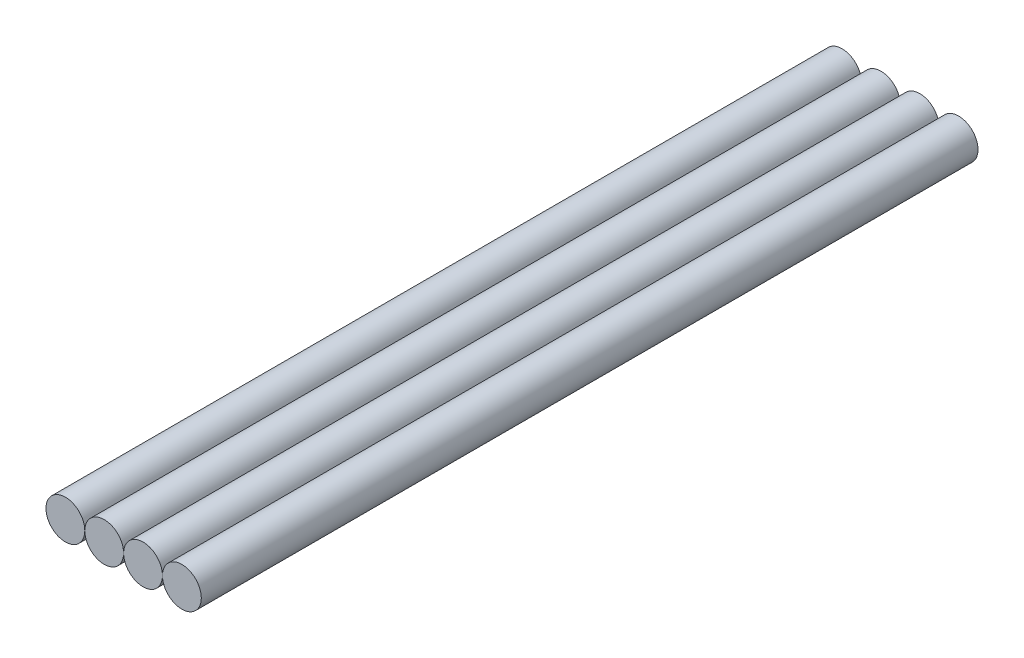
ISO-10303-21;
HEADER;
FILE_DESCRIPTION(('STEP AP214'),'2;1');
FILE_NAME('part.step','',(''),(''),'','','');
FILE_SCHEMA(('AUTOMOTIVE_DESIGN { 1 0 10303 214 1 1 1 1 }'));
ENDSEC;
DATA;
#1=APPLICATION_CONTEXT('core data for automotive mechanical design processes');
#2=APPLICATION_PROTOCOL_DEFINITION('international standard','automotive_design',2000,#1);
#3=PRODUCT_CONTEXT('',#1,'mechanical');
#4=PRODUCT('Part','Part','',(#3));
#5=PRODUCT_RELATED_PRODUCT_CATEGORY('part','',(#4));
#6=PRODUCT_DEFINITION_FORMATION('','',#4);
#7=PRODUCT_DEFINITION_CONTEXT('part definition',#1,'design');
#8=PRODUCT_DEFINITION('design','',#6,#7);
#9=PRODUCT_DEFINITION_SHAPE('','',#8);
#10=(LENGTH_UNIT() NAMED_UNIT(*) SI_UNIT(.MILLI.,.METRE.));
#11=(NAMED_UNIT(*) PLANE_ANGLE_UNIT() SI_UNIT($,.RADIAN.));
#12=(NAMED_UNIT(*) SI_UNIT($,.STERADIAN.) SOLID_ANGLE_UNIT());
#13=UNCERTAINTY_MEASURE_WITH_UNIT(LENGTH_MEASURE(1.E-05),#10,'distance_accuracy_value','');
#14=(GEOMETRIC_REPRESENTATION_CONTEXT(3) GLOBAL_UNCERTAINTY_ASSIGNED_CONTEXT((#13)) GLOBAL_UNIT_ASSIGNED_CONTEXT((#10,
#11,#12)) REPRESENTATION_CONTEXT('',''));
#15=CARTESIAN_POINT('',(0.,0.,0.));
#16=DIRECTION('',(0.,0.,1.));
#17=DIRECTION('',(1.,0.,0.));
#18=AXIS2_PLACEMENT_3D('',#15,#16,#17);
#19=CARTESIAN_POINT('',(3.26399414195173,-7.63427077836029,45.0000000000159));
#20=DIRECTION('',(0.,0.,-1.));
#21=DIRECTION('',(-1.,0.,0.));
#22=AXIS2_PLACEMENT_3D('',#19,#20,#21);
#23=CYLINDRICAL_SURFACE('',#22,0.5);
#24=CARTESIAN_POINT('',(3.26399414195173,-7.63427077836029,45.0000000000159));
#25=DIRECTION('',(0.,0.,1.));
#26=DIRECTION('',(1.,0.,0.));
#27=AXIS2_PLACEMENT_3D('',#24,#25,#26);
#28=CIRCLE('',#27,0.5);
#29=CARTESIAN_POINT('',(3.76399414195173,-7.63427077836029,45.0000000000159));
#30=VERTEX_POINT('',#29);
#31=EDGE_CURVE('E11',#30,#30,#28,.T.);
#32=ORIENTED_EDGE('',*,*,#31,.F.);
#33=EDGE_LOOP('',(#32));
#34=FACE_BOUND('',#33,.T.);
#35=CARTESIAN_POINT('',(3.26399414195173,-7.63427077836029,25.0000000000159));
#36=DIRECTION('',(0.,0.,1.));
#37=DIRECTION('',(1.,0.,0.));
#38=AXIS2_PLACEMENT_3D('',#35,#36,#37);
#39=CIRCLE('',#38,0.5);
#40=CARTESIAN_POINT('',(3.76399414195173,-7.63427077836029,25.0000000000159));
#41=VERTEX_POINT('',#40);
#42=EDGE_CURVE('E57',#41,#41,#39,.T.);
#43=ORIENTED_EDGE('',*,*,#42,.T.);
#44=EDGE_LOOP('',(#43));
#45=FACE_BOUND('',#44,.T.);
#46=ADVANCED_FACE('F54',(#34,#45),#23,.T.);
#47=CARTESIAN_POINT('',(3.26399414195173,-7.63427077836029,45.0000000000159));
#48=DIRECTION('',(0.,0.,1.));
#49=DIRECTION('',(1.,0.,0.));
#50=AXIS2_PLACEMENT_3D('',#47,#48,#49);
#51=PLANE('',#50);
#52=ORIENTED_EDGE('',*,*,#31,.T.);
#53=EDGE_LOOP('',(#52));
#54=FACE_BOUND('',#53,.T.);
#55=ADVANCED_FACE('F69',(#54),#51,.T.);
#56=CARTESIAN_POINT('',(3.26399414195173,-7.63427077836029,25.0000000000159));
#57=DIRECTION('',(0.,0.,1.));
#58=DIRECTION('',(1.,0.,0.));
#59=AXIS2_PLACEMENT_3D('',#56,#57,#58);
#60=PLANE('',#59);
#61=ORIENTED_EDGE('',*,*,#42,.F.);
#62=EDGE_LOOP('',(#61));
#63=FACE_BOUND('',#62,.T.);
#64=ADVANCED_FACE('F67',(#63),#60,.F.);
#65=CLOSED_SHELL('',(#46,#55,#64));
#66=MANIFOLD_SOLID_BREP('B2',#65);
#67=CARTESIAN_POINT('',(6.26399414195173,-7.63427077836029,45.0000000000159));
#68=DIRECTION('',(0.,0.,-1.));
#69=DIRECTION('',(-1.,0.,0.));
#70=AXIS2_PLACEMENT_3D('',#67,#68,#69);
#71=CYLINDRICAL_SURFACE('',#70,0.5);
#72=CARTESIAN_POINT('',(6.26399414195173,-7.63427077836029,45.0000000000159));
#73=DIRECTION('',(0.,0.,1.));
#74=DIRECTION('',(1.,0.,0.));
#75=AXIS2_PLACEMENT_3D('',#72,#73,#74);
#76=CIRCLE('',#75,0.5);
#77=CARTESIAN_POINT('',(6.76399414195173,-7.63427077836029,45.0000000000159));
#78=VERTEX_POINT('',#77);
#79=EDGE_CURVE('E53',#78,#78,#76,.T.);
#80=ORIENTED_EDGE('',*,*,#79,.F.);
#81=EDGE_LOOP('',(#80));
#82=FACE_BOUND('',#81,.T.);
#83=CARTESIAN_POINT('',(6.26399414195173,-7.63427077836029,25.0000000000159));
#84=DIRECTION('',(0.,0.,1.));
#85=DIRECTION('',(1.,0.,0.));
#86=AXIS2_PLACEMENT_3D('',#83,#84,#85);
#87=CIRCLE('',#86,0.5);
#88=CARTESIAN_POINT('',(6.76399414195173,-7.63427077836029,25.0000000000159));
#89=VERTEX_POINT('',#88);
#90=EDGE_CURVE('E141',#89,#89,#87,.T.);
#91=ORIENTED_EDGE('',*,*,#90,.T.);
#92=EDGE_LOOP('',(#91));
#93=FACE_BOUND('',#92,.T.);
#94=ADVANCED_FACE('F138',(#82,#93),#71,.T.);
#95=CARTESIAN_POINT('',(6.26399414195173,-7.63427077836029,45.0000000000159));
#96=DIRECTION('',(0.,0.,1.));
#97=DIRECTION('',(1.,0.,0.));
#98=AXIS2_PLACEMENT_3D('',#95,#96,#97);
#99=PLANE('',#98);
#100=ORIENTED_EDGE('',*,*,#79,.T.);
#101=EDGE_LOOP('',(#100));
#102=FACE_BOUND('',#101,.T.);
#103=ADVANCED_FACE('F153',(#102),#99,.T.);
#104=CARTESIAN_POINT('',(6.26399414195173,-7.63427077836029,25.0000000000159));
#105=DIRECTION('',(0.,0.,1.));
#106=DIRECTION('',(1.,0.,0.));
#107=AXIS2_PLACEMENT_3D('',#104,#105,#106);
#108=PLANE('',#107);
#109=ORIENTED_EDGE('',*,*,#90,.F.);
#110=EDGE_LOOP('',(#109));
#111=FACE_BOUND('',#110,.T.);
#112=ADVANCED_FACE('F151',(#111),#108,.F.);
#113=CLOSED_SHELL('',(#94,#103,#112));
#114=MANIFOLD_SOLID_BREP('B6',#113);
#115=CARTESIAN_POINT('',(5.26399414195173,-7.63427077836029,45.0000000000159));
#116=DIRECTION('',(0.,0.,-1.));
#117=DIRECTION('',(-1.,0.,0.));
#118=AXIS2_PLACEMENT_3D('',#115,#116,#117);
#119=CYLINDRICAL_SURFACE('',#118,0.5);
#120=CARTESIAN_POINT('',(5.26399414195173,-7.63427077836029,45.0000000000159));
#121=DIRECTION('',(0.,0.,1.));
#122=DIRECTION('',(1.,0.,0.));
#123=AXIS2_PLACEMENT_3D('',#120,#121,#122);
#124=CIRCLE('',#123,0.5);
#125=CARTESIAN_POINT('',(5.76399414195173,-7.63427077836029,45.0000000000159));
#126=VERTEX_POINT('',#125);
#127=EDGE_CURVE('E137',#126,#126,#124,.T.);
#128=ORIENTED_EDGE('',*,*,#127,.F.);
#129=EDGE_LOOP('',(#128));
#130=FACE_BOUND('',#129,.T.);
#131=CARTESIAN_POINT('',(5.26399414195173,-7.63427077836029,25.0000000000159));
#132=DIRECTION('',(0.,0.,1.));
#133=DIRECTION('',(1.,0.,0.));
#134=AXIS2_PLACEMENT_3D('',#131,#132,#133);
#135=CIRCLE('',#134,0.5);
#136=CARTESIAN_POINT('',(5.76399414195173,-7.63427077836029,25.0000000000159));
#137=VERTEX_POINT('',#136);
#138=EDGE_CURVE('E224',#137,#137,#135,.T.);
#139=ORIENTED_EDGE('',*,*,#138,.T.);
#140=EDGE_LOOP('',(#139));
#141=FACE_BOUND('',#140,.T.);
#142=ADVANCED_FACE('F221',(#130,#141),#119,.T.);
#143=CARTESIAN_POINT('',(5.26399414195173,-7.63427077836029,45.0000000000159));
#144=DIRECTION('',(0.,0.,1.));
#145=DIRECTION('',(1.,0.,0.));
#146=AXIS2_PLACEMENT_3D('',#143,#144,#145);
#147=PLANE('',#146);
#148=ORIENTED_EDGE('',*,*,#127,.T.);
#149=EDGE_LOOP('',(#148));
#150=FACE_BOUND('',#149,.T.);
#151=ADVANCED_FACE('F236',(#150),#147,.T.);
#152=CARTESIAN_POINT('',(5.26399414195173,-7.63427077836029,25.0000000000159));
#153=DIRECTION('',(0.,0.,1.));
#154=DIRECTION('',(1.,0.,0.));
#155=AXIS2_PLACEMENT_3D('',#152,#153,#154);
#156=PLANE('',#155);
#157=ORIENTED_EDGE('',*,*,#138,.F.);
#158=EDGE_LOOP('',(#157));
#159=FACE_BOUND('',#158,.T.);
#160=ADVANCED_FACE('F234',(#159),#156,.F.);
#161=CLOSED_SHELL('',(#142,#151,#160));
#162=MANIFOLD_SOLID_BREP('B48',#161);
#163=CARTESIAN_POINT('',(4.26399414195173,-7.63427077836029,45.0000000000159));
#164=DIRECTION('',(0.,0.,-1.));
#165=DIRECTION('',(-1.,0.,0.));
#166=AXIS2_PLACEMENT_3D('',#163,#164,#165);
#167=CYLINDRICAL_SURFACE('',#166,0.5);
#168=CARTESIAN_POINT('',(4.26399414195173,-7.63427077836029,45.0000000000159));
#169=DIRECTION('',(0.,0.,1.));
#170=DIRECTION('',(1.,0.,0.));
#171=AXIS2_PLACEMENT_3D('',#168,#169,#170);
#172=CIRCLE('',#171,0.5);
#173=CARTESIAN_POINT('',(4.76399414195173,-7.63427077836029,45.0000000000159));
#174=VERTEX_POINT('',#173);
#175=EDGE_CURVE('E220',#174,#174,#172,.T.);
#176=ORIENTED_EDGE('',*,*,#175,.F.);
#177=EDGE_LOOP('',(#176));
#178=FACE_BOUND('',#177,.T.);
#179=CARTESIAN_POINT('',(4.26399414195173,-7.63427077836029,25.0000000000159));
#180=DIRECTION('',(0.,0.,1.));
#181=DIRECTION('',(1.,0.,0.));
#182=AXIS2_PLACEMENT_3D('',#179,#180,#181);
#183=CIRCLE('',#182,0.5);
#184=CARTESIAN_POINT('',(4.76399414195173,-7.63427077836029,25.0000000000159));
#185=VERTEX_POINT('',#184);
#186=EDGE_CURVE('E300',#185,#185,#183,.T.);
#187=ORIENTED_EDGE('',*,*,#186,.T.);
#188=EDGE_LOOP('',(#187));
#189=FACE_BOUND('',#188,.T.);
#190=ADVANCED_FACE('F297',(#178,#189),#167,.T.);
#191=CARTESIAN_POINT('',(4.26399414195173,-7.63427077836029,45.0000000000159));
#192=DIRECTION('',(0.,0.,1.));
#193=DIRECTION('',(1.,0.,0.));
#194=AXIS2_PLACEMENT_3D('',#191,#192,#193);
#195=PLANE('',#194);
#196=ORIENTED_EDGE('',*,*,#175,.T.);
#197=EDGE_LOOP('',(#196));
#198=FACE_BOUND('',#197,.T.);
#199=ADVANCED_FACE('F312',(#198),#195,.T.);
#200=CARTESIAN_POINT('',(4.26399414195173,-7.63427077836029,25.0000000000159));
#201=DIRECTION('',(0.,0.,1.));
#202=DIRECTION('',(1.,0.,0.));
#203=AXIS2_PLACEMENT_3D('',#200,#201,#202);
#204=PLANE('',#203);
#205=ORIENTED_EDGE('',*,*,#186,.F.);
#206=EDGE_LOOP('',(#205));
#207=FACE_BOUND('',#206,.T.);
#208=ADVANCED_FACE('F310',(#207),#204,.F.);
#209=CLOSED_SHELL('',(#190,#199,#208));
#210=MANIFOLD_SOLID_BREP('B132',#209);
#211=ADVANCED_BREP_SHAPE_REPRESENTATION('',(#18,#66,#114,#162,#210),#14);
#212=SHAPE_DEFINITION_REPRESENTATION(#9,#211);
ENDSEC;
END-ISO-10303-21;
